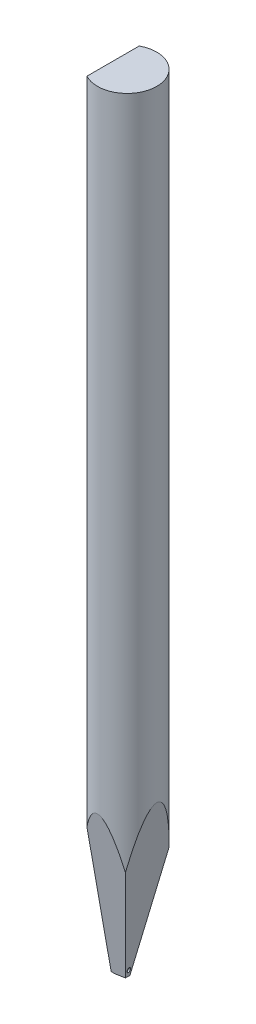
ISO-10303-21;
HEADER;
FILE_DESCRIPTION(('STEP AP214'),'2;1');
FILE_NAME('part.step','',(''),(''),'','','');
FILE_SCHEMA(('AUTOMOTIVE_DESIGN { 1 0 10303 214 1 1 1 1 }'));
ENDSEC;
DATA;
#1=APPLICATION_CONTEXT('core data for automotive mechanical design processes');
#2=APPLICATION_PROTOCOL_DEFINITION('international standard','automotive_design',2000,#1);
#3=PRODUCT_CONTEXT('',#1,'mechanical');
#4=PRODUCT('Part','Part','',(#3));
#5=PRODUCT_RELATED_PRODUCT_CATEGORY('part','',(#4));
#6=PRODUCT_DEFINITION_FORMATION('','',#4);
#7=PRODUCT_DEFINITION_CONTEXT('part definition',#1,'design');
#8=PRODUCT_DEFINITION('design','',#6,#7);
#9=PRODUCT_DEFINITION_SHAPE('','',#8);
#10=(LENGTH_UNIT() NAMED_UNIT(*) SI_UNIT(.MILLI.,.METRE.));
#11=(NAMED_UNIT(*) PLANE_ANGLE_UNIT() SI_UNIT($,.RADIAN.));
#12=(NAMED_UNIT(*) SI_UNIT($,.STERADIAN.) SOLID_ANGLE_UNIT());
#13=UNCERTAINTY_MEASURE_WITH_UNIT(LENGTH_MEASURE(1.E-05),#10,'distance_accuracy_value','');
#14=(GEOMETRIC_REPRESENTATION_CONTEXT(3) GLOBAL_UNCERTAINTY_ASSIGNED_CONTEXT((#13)) GLOBAL_UNIT_ASSIGNED_CONTEXT((#10,
#11,#12)) REPRESENTATION_CONTEXT('',''));
#15=CARTESIAN_POINT('',(0.,0.,0.));
#16=DIRECTION('',(0.,0.,1.));
#17=DIRECTION('',(1.,0.,0.));
#18=AXIS2_PLACEMENT_3D('',#15,#16,#17);
#19=CARTESIAN_POINT('',(26.8738719491216,0.,0.0508));
#20=DIRECTION('',(0.,-0.173648177666931,0.984807753012208));
#21=DIRECTION('',(0.,-0.984807753012208,-0.173648177666931));
#22=AXIS2_PLACEMENT_3D('',#19,#20,#21);
#23=PLANE('',#22);
#24=CARTESIAN_POINT('',(-0.35052,0.0254,0.0552787053099968));
#25=DIRECTION('',(0.,-0.173648177666931,0.984807753012208));
#26=DIRECTION('',(0.,-0.984807753012208,-0.173648177666931));
#27=AXIS2_PLACEMENT_3D('',#24,#25,#26);
#28=ELLIPSE('',#27,0.0257918359418979,0.0254);
#29=CARTESIAN_POINT('',(-0.35052,0.,0.0508000000000018));
#30=VERTEX_POINT('',#29);
#31=CARTESIAN_POINT('',(-0.37592,0.0254,0.0552787053099968));
#32=VERTEX_POINT('',#31);
#33=EDGE_CURVE('E68',#30,#32,#28,.F.);
#34=ORIENTED_EDGE('',*,*,#33,.F.);
#35=DIRECTION('',(-1.,0.,0.));
#36=VECTOR('',#35,1.);
#37=CARTESIAN_POINT('',(26.8738719491216,0.,0.0508));
#38=LINE('',#37,#36);
#39=CARTESIAN_POINT('',(-0.277370032000001,0.,0.0508));
#40=VERTEX_POINT('',#39);
#41=EDGE_CURVE('E421',#40,#30,#38,.T.);
#42=ORIENTED_EDGE('',*,*,#41,.F.);
#43=DIRECTION('',(-0.984346441568213,-0.173566836012845,-0.0306045161452665));
#44=VECTOR('',#43,1.);
#45=CARTESIAN_POINT('',(26.0304978179113,4.63878690685217,0.868743289435208));
#46=LINE('',#45,#44);
#47=CARTESIAN_POINT('',(0.0141435069447581,0.051401702157769,0.0598635069447552));
#48=VERTEX_POINT('',#47);
#49=EDGE_CURVE('E423',#48,#40,#46,.T.);
#50=ORIENTED_EDGE('',*,*,#49,.F.);
#51=DIRECTION('',(-0.171087869746036,-0.970287525247814,-0.171087869746036));
#52=VECTOR('',#51,1.);
#53=CARTESIAN_POINT('',(0.791557999082992,4.46033837772866,0.837277999082991));
#54=LINE('',#53,#52);
#55=CARTESIAN_POINT('',(0.537041505266774,3.0169036135559,0.582761505266773));
#56=VERTEX_POINT('',#55);
#57=EDGE_CURVE('E426',#56,#48,#54,.T.);
#58=ORIENTED_EDGE('',*,*,#57,.F.);
#59=CARTESIAN_POINT('',(0.,-0.288101116436578,0.));
#60=DIRECTION('',(0.,-0.173648177666931,0.984807753012208));
#61=DIRECTION('',(0.,-0.984807753012208,-0.173648177666931));
#62=AXIS2_PLACEMENT_3D('',#59,#60,#61);
#63=ELLIPSE('',#62,4.56371043248163,0.792479999999998);
#64=CARTESIAN_POINT('',(-0.37592,3.66844093071415,0.69764511322018));
#65=VERTEX_POINT('',#64);
#66=EDGE_CURVE('E415',#56,#65,#63,.T.);
#67=ORIENTED_EDGE('',*,*,#66,.T.);
#68=DIRECTION('',(0.,0.984807753012208,0.173648177666931));
#69=VECTOR('',#68,1.);
#70=CARTESIAN_POINT('',(-0.37592,20.251112252608,3.62161747949059));
#71=LINE('',#70,#69);
#72=EDGE_CURVE('E401',#32,#65,#71,.T.);
#73=ORIENTED_EDGE('',*,*,#72,.F.);
#74=EDGE_LOOP('',(#34,#42,#50,#58,#67,#73));
#75=FACE_BOUND('',#74,.T.);
#76=ADVANCED_FACE('F46',(#75),#23,.T.);
#77=CARTESIAN_POINT('',(26.8738719491216,0.,-0.0508));
#78=DIRECTION('',(0.,-0.173648177666931,-0.984807753012208));
#79=DIRECTION('',(0.,0.984807753012208,-0.173648177666931));
#80=AXIS2_PLACEMENT_3D('',#77,#78,#79);
#81=PLANE('',#80);
#82=CARTESIAN_POINT('',(-0.35052,0.0254,-0.0552787053099968));
#83=DIRECTION('',(0.,-0.173648177666931,-0.984807753012208));
#84=DIRECTION('',(0.,0.984807753012208,-0.173648177666931));
#85=AXIS2_PLACEMENT_3D('',#82,#83,#84);
#86=ELLIPSE('',#85,0.0257918359418979,0.0254);
#87=CARTESIAN_POINT('',(-0.37592,0.0254,-0.0552787053099968));
#88=VERTEX_POINT('',#87);
#89=CARTESIAN_POINT('',(-0.35052,0.,-0.0508000000000018));
#90=VERTEX_POINT('',#89);
#91=EDGE_CURVE('E478',#88,#90,#86,.F.);
#92=ORIENTED_EDGE('',*,*,#91,.F.);
#93=DIRECTION('',(0.,-0.984807753012208,0.173648177666931));
#94=VECTOR('',#93,1.);
#95=CARTESIAN_POINT('',(-0.37592,20.5255765703836,-3.67001294395617));
#96=LINE('',#95,#94);
#97=CARTESIAN_POINT('',(-0.37592,3.66844093071414,-0.69764511322018));
#98=VERTEX_POINT('',#97);
#99=EDGE_CURVE('E399',#98,#88,#96,.T.);
#100=ORIENTED_EDGE('',*,*,#99,.F.);
#101=CARTESIAN_POINT('',(0.,-0.288101116436578,0.));
#102=DIRECTION('',(0.,-0.173648177666931,-0.984807753012208));
#103=DIRECTION('',(0.,-0.984807753012208,0.173648177666931));
#104=AXIS2_PLACEMENT_3D('',#101,#102,#103);
#105=ELLIPSE('',#104,4.56371043248163,0.792479999999998);
#106=CARTESIAN_POINT('',(0.537041505266774,3.0169036135559,-0.582761505266773));
#107=VERTEX_POINT('',#106);
#108=EDGE_CURVE('E413',#98,#107,#105,.T.);
#109=ORIENTED_EDGE('',*,*,#108,.T.);
#110=DIRECTION('',(0.171087869746036,0.970287525247814,-0.171087869746036));
#111=VECTOR('',#110,1.);
#112=CARTESIAN_POINT('',(0.791557999082992,4.46033837772866,-0.837277999082991));
#113=LINE('',#112,#111);
#114=CARTESIAN_POINT('',(0.0141435069447581,0.051401702157769,-0.0598635069447552));
#115=VERTEX_POINT('',#114);
#116=EDGE_CURVE('E396',#115,#107,#113,.T.);
#117=ORIENTED_EDGE('',*,*,#116,.F.);
#118=DIRECTION('',(0.984346441568213,0.173566836012845,-0.0306045161452665));
#119=VECTOR('',#118,1.);
#120=CARTESIAN_POINT('',(26.0304978179113,4.63878690685217,-0.868743289435208));
#121=LINE('',#120,#119);
#122=CARTESIAN_POINT('',(-0.277370032000001,0.,-0.0508));
#123=VERTEX_POINT('',#122);
#124=EDGE_CURVE('E393',#123,#115,#121,.T.);
#125=ORIENTED_EDGE('',*,*,#124,.F.);
#126=DIRECTION('',(-1.,0.,0.));
#127=VECTOR('',#126,1.);
#128=CARTESIAN_POINT('',(26.8738719491216,0.,-0.0508));
#129=LINE('',#128,#127);
#130=EDGE_CURVE('E418',#123,#90,#129,.T.);
#131=ORIENTED_EDGE('',*,*,#130,.T.);
#132=EDGE_LOOP('',(#92,#100,#109,#117,#125,#131));
#133=FACE_BOUND('',#132,.T.);
#134=ADVANCED_FACE('F271',(#133),#81,.T.);
#135=CARTESIAN_POINT('',(-0.37592,0.,0.01397));
#136=DIRECTION('',(0.,0.422618261740697,0.906307787036651));
#137=DIRECTION('',(0.,-0.906307787036651,0.422618261740697));
#138=AXIS2_PLACEMENT_3D('',#135,#136,#137);
#139=PLANE('',#138);
#140=DIRECTION('',(1.,0.,0.));
#141=VECTOR('',#140,1.);
#142=CARTESIAN_POINT('',(-0.37592,0.,0.01397));
#143=LINE('',#142,#141);
#144=CARTESIAN_POINT('',(-0.35052,0.,0.0139699999999948));
#145=VERTEX_POINT('',#144);
#146=CARTESIAN_POINT('',(-0.320285479258089,0.,0.01397));
#147=VERTEX_POINT('',#146);
#148=EDGE_CURVE('E439',#145,#147,#143,.T.);
#149=ORIENTED_EDGE('',*,*,#148,.F.);
#150=CARTESIAN_POINT('',(-0.35052,0.0254,0.00212578548285797));
#151=DIRECTION('',(0.,0.422618261740697,0.906307787036651));
#152=DIRECTION('',(0.,0.906307787036651,-0.422618261740697));
#153=AXIS2_PLACEMENT_3D('',#150,#151,#152);
#154=ELLIPSE('',#153,0.0280257991416472,0.0254);
#155=CARTESIAN_POINT('',(-0.373759405370795,0.0151486567703607,0.00690606533721928));
#156=VERTEX_POINT('',#155);
#157=EDGE_CURVE('E193',#145,#156,#154,.F.);
#158=ORIENTED_EDGE('',*,*,#157,.T.);
#159=DIRECTION('',(1.,0.,0.));
#160=VECTOR('',#159,1.);
#161=CARTESIAN_POINT('',(-0.37592,0.0151486567703607,0.00690606533721928));
#162=LINE('',#161,#160);
#163=CARTESIAN_POINT('',(-0.315593019285911,0.0153362178491699,0.00681223538900085));
#164=VERTEX_POINT('',#163);
#165=EDGE_CURVE('E54',#156,#164,#162,.T.);
#166=ORIENTED_EDGE('',*,*,#165,.T.);
#167=CARTESIAN_POINT('',(-0.278493907204909,0.0299587616795187,0.));
#168=DIRECTION('',(0.,0.422618261740697,0.906307787036651));
#169=DIRECTION('',(-0.537278777543525,-0.764384261857971,0.356438235077525));
#170=AXIS2_PLACEMENT_3D('',#167,#168,#169);
#171=ELLIPSE('',#170,0.0693992577462933,0.0254);
#172=EDGE_CURVE('E373',#164,#147,#171,.T.);
#173=ORIENTED_EDGE('',*,*,#172,.T.);
#174=EDGE_LOOP('',(#149,#158,#166,#173));
#175=FACE_BOUND('',#174,.T.);
#176=ADVANCED_FACE('F268',(#175),#139,.F.);
#177=CARTESIAN_POINT('',(-0.37592,0.0151486567703607,-0.00690606533721928));
#178=DIRECTION('',(0.,0.422618261740697,-0.906307787036651));
#179=DIRECTION('',(0.,0.906307787036651,0.422618261740697));
#180=AXIS2_PLACEMENT_3D('',#177,#178,#179);
#181=PLANE('',#180);
#182=DIRECTION('',(1.,0.,0.));
#183=VECTOR('',#182,1.);
#184=CARTESIAN_POINT('',(-0.37592,0.0151486567703607,-0.00690606533721928));
#185=LINE('',#184,#183);
#186=CARTESIAN_POINT('',(-0.373759405370795,0.0151486567703607,-0.00690606533721928));
#187=VERTEX_POINT('',#186);
#188=CARTESIAN_POINT('',(-0.315269012538432,0.0151486567703607,-0.00690606533721928));
#189=VERTEX_POINT('',#188);
#190=EDGE_CURVE('E232',#187,#189,#185,.T.);
#191=ORIENTED_EDGE('',*,*,#190,.F.);
#192=CARTESIAN_POINT('',(-0.35052,0.0254,-0.00212578548286144));
#193=DIRECTION('',(0.,0.422618261740697,-0.906307787036651));
#194=DIRECTION('',(0.,-0.906307787036651,-0.422618261740697));
#195=AXIS2_PLACEMENT_3D('',#192,#193,#194);
#196=ELLIPSE('',#195,0.0280257991416472,0.0254);
#197=CARTESIAN_POINT('',(-0.35052,0.,-0.0139699999999983));
#198=VERTEX_POINT('',#197);
#199=EDGE_CURVE('E200',#187,#198,#196,.F.);
#200=ORIENTED_EDGE('',*,*,#199,.T.);
#201=DIRECTION('',(1.,0.,0.));
#202=VECTOR('',#201,1.);
#203=CARTESIAN_POINT('',(-0.37592,0.,-0.01397));
#204=LINE('',#203,#202);
#205=CARTESIAN_POINT('',(-0.320285479258089,0.,-0.01397));
#206=VERTEX_POINT('',#205);
#207=EDGE_CURVE('E234',#198,#206,#204,.T.);
#208=ORIENTED_EDGE('',*,*,#207,.T.);
#209=CARTESIAN_POINT('',(-0.278493907204909,0.0299587616795187,0.));
#210=DIRECTION('',(0.,0.422618261740697,-0.906307787036651));
#211=DIRECTION('',(-0.537278777543525,-0.764384261857971,-0.356438235077525));
#212=AXIS2_PLACEMENT_3D('',#209,#210,#211);
#213=ELLIPSE('',#212,0.0693992577462933,0.0254);
#214=EDGE_CURVE('E391',#206,#189,#213,.T.);
#215=ORIENTED_EDGE('',*,*,#214,.T.);
#216=EDGE_LOOP('',(#191,#200,#208,#215));
#217=FACE_BOUND('',#216,.T.);
#218=ADVANCED_FACE('F270',(#217),#181,.F.);
#219=CARTESIAN_POINT('',(-0.277370032,0.,27.2760283406468));
#220=DIRECTION('',(-0.173648177666931,0.984807753012208,0.));
#221=DIRECTION('',(-0.984807753012208,-0.173648177666931,0.));
#222=AXIS2_PLACEMENT_3D('',#219,#220,#221);
#223=PLANE('',#222);
#224=DIRECTION('',(-0.984807753012208,-0.173648177666931,0.));
#225=VECTOR('',#224,1.);
#226=CARTESIAN_POINT('',(-0.277370032,0.,0.0253999999999983));
#227=LINE('',#226,#225);
#228=CARTESIAN_POINT('',(-0.1397,0.0242749410765979,0.0253999999999992));
#229=VERTEX_POINT('',#228);
#230=CARTESIAN_POINT('',(-0.277370032,0.,0.0253999999999992));
#231=VERTEX_POINT('',#230);
#232=EDGE_CURVE('E369',#229,#231,#227,.T.);
#233=ORIENTED_EDGE('',*,*,#232,.F.);
#234=DIRECTION('',(0.,0.,1.));
#235=VECTOR('',#234,1.);
#236=CARTESIAN_POINT('',(-0.1397,0.0242749410765979,27.2760283406468));
#237=LINE('',#236,#235);
#238=CARTESIAN_POINT('',(-0.1397,0.0242749410765979,-0.0253999999999992));
#239=VERTEX_POINT('',#238);
#240=EDGE_CURVE('E387',#239,#229,#237,.T.);
#241=ORIENTED_EDGE('',*,*,#240,.F.);
#242=DIRECTION('',(-0.984807753012208,-0.173648177666931,0.));
#243=VECTOR('',#242,1.);
#244=CARTESIAN_POINT('',(-0.277370032,0.,-0.0253999999999983));
#245=LINE('',#244,#243);
#246=CARTESIAN_POINT('',(-0.277370032,0.,-0.0253999999999992));
#247=VERTEX_POINT('',#246);
#248=EDGE_CURVE('E389',#239,#247,#245,.T.);
#249=ORIENTED_EDGE('',*,*,#248,.T.);
#250=DIRECTION('',(0.,0.,-1.));
#251=VECTOR('',#250,1.);
#252=CARTESIAN_POINT('',(-0.277370032,0.,27.2760283406468));
#253=LINE('',#252,#251);
#254=EDGE_CURVE('E435',#247,#123,#253,.T.);
#255=ORIENTED_EDGE('',*,*,#254,.T.);
#256=ORIENTED_EDGE('',*,*,#124,.T.);
#257=DIRECTION('',(0.,0.,-1.));
#258=VECTOR('',#257,1.);
#259=CARTESIAN_POINT('',(0.014143506944755,0.0514017021577685,27.2760283406468));
#260=LINE('',#259,#258);
#261=EDGE_CURVE('E436',#48,#115,#260,.T.);
#262=ORIENTED_EDGE('',*,*,#261,.F.);
#263=ORIENTED_EDGE('',*,*,#49,.T.);
#264=EDGE_CURVE('E432',#40,#231,#253,.T.);
#265=ORIENTED_EDGE('',*,*,#264,.T.);
#266=EDGE_LOOP('',(#233,#241,#249,#255,#256,#262,#263,#265));
#267=FACE_BOUND('',#266,.T.);
#268=ADVANCED_FACE('F277',(#267),#223,.F.);
#269=CARTESIAN_POINT('',(0.,0.,0.));
#270=DIRECTION('',(0.,1.,0.));
#271=DIRECTION('',(0.,0.,1.));
#272=AXIS2_PLACEMENT_3D('',#269,#270,#271);
#273=PLANE('',#272);
#274=ORIENTED_EDGE('',*,*,#41,.T.);
#275=DIRECTION('',(0.,0.,-1.));
#276=VECTOR('',#275,1.);
#277=CARTESIAN_POINT('',(-0.35052,0.,26.4359805311631));
#278=LINE('',#277,#276);
#279=EDGE_CURVE('E202',#30,#145,#278,.T.);
#280=ORIENTED_EDGE('',*,*,#279,.T.);
#281=ORIENTED_EDGE('',*,*,#148,.T.);
#282=CARTESIAN_POINT('',(-0.295790606325167,0.,0.));
#283=DIRECTION('',(0.,1.,0.));
#284=DIRECTION('',(-1.,0.,0.));
#285=AXIS2_PLACEMENT_3D('',#282,#283,#284);
#286=ELLIPSE('',#285,0.0293293936748331,0.0254);
#287=CARTESIAN_POINT('',(-0.295790606325167,0.,0.0254));
#288=VERTEX_POINT('',#287);
#289=EDGE_CURVE('E375',#288,#147,#286,.F.);
#290=ORIENTED_EDGE('',*,*,#289,.F.);
#291=DIRECTION('',(1.,0.,0.));
#292=VECTOR('',#291,1.);
#293=CARTESIAN_POINT('',(-0.1397,0.,0.0254));
#294=LINE('',#293,#292);
#295=EDGE_CURVE('E464',#288,#231,#294,.T.);
#296=ORIENTED_EDGE('',*,*,#295,.T.);
#297=ORIENTED_EDGE('',*,*,#264,.F.);
#298=EDGE_LOOP('',(#274,#280,#281,#290,#296,#297));
#299=FACE_BOUND('',#298,.T.);
#300=ADVANCED_FACE('F301',(#299),#273,.F.);
#301=ORIENTED_EDGE('',*,*,#207,.F.);
#302=EDGE_CURVE('E204',#198,#90,#278,.T.);
#303=ORIENTED_EDGE('',*,*,#302,.T.);
#304=ORIENTED_EDGE('',*,*,#130,.F.);
#305=ORIENTED_EDGE('',*,*,#254,.F.);
#306=DIRECTION('',(1.,0.,0.));
#307=VECTOR('',#306,1.);
#308=CARTESIAN_POINT('',(-0.1397,0.,-0.0254));
#309=LINE('',#308,#307);
#310=CARTESIAN_POINT('',(-0.295790606325167,0.,-0.0254));
#311=VERTEX_POINT('',#310);
#312=EDGE_CURVE('E456',#311,#247,#309,.T.);
#313=ORIENTED_EDGE('',*,*,#312,.F.);
#314=EDGE_CURVE('E380',#206,#311,#286,.F.);
#315=ORIENTED_EDGE('',*,*,#314,.F.);
#316=EDGE_LOOP('',(#301,#303,#304,#305,#313,#315));
#317=FACE_BOUND('',#316,.T.);
#318=ADVANCED_FACE('F298',(#317),#273,.F.);
#319=CARTESIAN_POINT('',(0.,21.0312,0.));
#320=DIRECTION('',(0.,-1.,0.));
#321=DIRECTION('',(0.,0.,-1.));
#322=AXIS2_PLACEMENT_3D('',#319,#320,#321);
#323=CYLINDRICAL_SURFACE('',#322,0.792479999999998);
#324=ORIENTED_EDGE('',*,*,#66,.F.);
#325=CARTESIAN_POINT('',(0.,-0.0288101116436568,0.));
#326=DIRECTION('',(-0.984807753012208,0.173648177666931,0.));
#327=DIRECTION('',(-0.173648177666931,-0.984807753012208,0.));
#328=AXIS2_PLACEMENT_3D('',#325,#326,#327);
#329=ELLIPSE('',#328,4.56371043248164,0.792479999999998);
#330=EDGE_CURVE('E429',#56,#107,#329,.T.);
#331=ORIENTED_EDGE('',*,*,#330,.T.);
#332=ORIENTED_EDGE('',*,*,#108,.F.);
#333=DIRECTION('',(0.,-1.,0.));
#334=VECTOR('',#333,1.);
#335=CARTESIAN_POINT('',(-0.37592,21.0312,-0.69764511322018));
#336=LINE('',#335,#334);
#337=CARTESIAN_POINT('',(-0.37592,21.0312,-0.69764511322018));
#338=VERTEX_POINT('',#337);
#339=EDGE_CURVE('E406',#338,#98,#336,.T.);
#340=ORIENTED_EDGE('',*,*,#339,.F.);
#341=CARTESIAN_POINT('',(0.,21.0312,0.));
#342=DIRECTION('',(0.,1.,0.));
#343=DIRECTION('',(0.,0.,1.));
#344=AXIS2_PLACEMENT_3D('',#341,#342,#343);
#345=CIRCLE('',#344,0.792479999999998);
#346=CARTESIAN_POINT('',(-0.37592,21.0312,0.69764511322018));
#347=VERTEX_POINT('',#346);
#348=EDGE_CURVE('E403',#347,#338,#345,.T.);
#349=ORIENTED_EDGE('',*,*,#348,.F.);
#350=DIRECTION('',(0.,-1.,0.));
#351=VECTOR('',#350,1.);
#352=CARTESIAN_POINT('',(-0.37592,21.0312,0.69764511322018));
#353=LINE('',#352,#351);
#354=EDGE_CURVE('E409',#65,#347,#353,.F.);
#355=ORIENTED_EDGE('',*,*,#354,.F.);
#356=EDGE_LOOP('',(#324,#331,#332,#340,#349,#355));
#357=FACE_BOUND('',#356,.T.);
#358=ADVANCED_FACE('F293',(#357),#323,.T.);
#359=CARTESIAN_POINT('',(-0.37592,21.0312,-0.80247998));
#360=DIRECTION('',(-1.,0.,0.));
#361=DIRECTION('',(0.,0.,1.));
#362=AXIS2_PLACEMENT_3D('',#359,#360,#361);
#363=PLANE('',#362);
#364=DIRECTION('',(0.,0.,-1.));
#365=VECTOR('',#364,1.);
#366=CARTESIAN_POINT('',(-0.37592,0.0254,26.4359805311631));
#367=LINE('',#366,#365);
#368=EDGE_CURVE('E76',#32,#88,#367,.T.);
#369=ORIENTED_EDGE('',*,*,#368,.F.);
#370=ORIENTED_EDGE('',*,*,#72,.T.);
#371=ORIENTED_EDGE('',*,*,#354,.T.);
#372=DIRECTION('',(0.,0.,-1.));
#373=VECTOR('',#372,1.);
#374=CARTESIAN_POINT('',(-0.37592,21.0312,-0.80247998));
#375=LINE('',#374,#373);
#376=EDGE_CURVE('E411',#347,#338,#375,.T.);
#377=ORIENTED_EDGE('',*,*,#376,.T.);
#378=ORIENTED_EDGE('',*,*,#339,.T.);
#379=ORIENTED_EDGE('',*,*,#99,.T.);
#380=EDGE_LOOP('',(#369,#370,#371,#377,#378,#379));
#381=FACE_BOUND('',#380,.T.);
#382=ADVANCED_FACE('F289',(#381),#363,.T.);
#383=CARTESIAN_POINT('',(0.,21.0312,0.));
#384=DIRECTION('',(0.,1.,0.));
#385=DIRECTION('',(0.,0.,1.));
#386=AXIS2_PLACEMENT_3D('',#383,#384,#385);
#387=PLANE('',#386);
#388=ORIENTED_EDGE('',*,*,#348,.T.);
#389=ORIENTED_EDGE('',*,*,#376,.F.);
#390=EDGE_LOOP('',(#388,#389));
#391=FACE_BOUND('',#390,.T.);
#392=ADVANCED_FACE('F292',(#391),#387,.T.);
#393=CARTESIAN_POINT('',(0.014143506944755,0.0514017021577685,27.2760283406468));
#394=DIRECTION('',(-0.984807753012208,0.173648177666931,0.));
#395=DIRECTION('',(-0.173648177666931,-0.984807753012208,0.));
#396=AXIS2_PLACEMENT_3D('',#393,#394,#395);
#397=PLANE('',#396);
#398=CARTESIAN_POINT('',(0.0432817426572091,0.216652848609544,0.));
#399=DIRECTION('',(-0.984807753012208,0.173648177666931,0.));
#400=DIRECTION('',(0.173648177666931,0.984807753012208,0.));
#401=AXIS2_PLACEMENT_3D('',#398,#399,#400);
#402=ELLIPSE('',#401,0.0636490170805515,0.0457181771462286);
#403=CARTESIAN_POINT('',(0.0543342784835383,0.279334894102078,0.));
#404=VERTEX_POINT('',#403);
#405=EDGE_CURVE('E376',#404,#404,#402,.F.);
#406=ORIENTED_EDGE('',*,*,#405,.F.);
#407=EDGE_LOOP('',(#406));
#408=FACE_BOUND('',#407,.T.);
#409=ORIENTED_EDGE('',*,*,#330,.F.);
#410=ORIENTED_EDGE('',*,*,#57,.T.);
#411=ORIENTED_EDGE('',*,*,#261,.T.);
#412=ORIENTED_EDGE('',*,*,#116,.T.);
#413=EDGE_LOOP('',(#409,#410,#411,#412));
#414=FACE_BOUND('',#413,.T.);
#415=ADVANCED_FACE('F296',(#408,#414),#397,.F.);
#416=CARTESIAN_POINT('',(-0.37592,0.0119283056158966,0.));
#417=DIRECTION('',(1.,0.,0.));
#418=DIRECTION('',(0.,0.,-1.));
#419=AXIS2_PLACEMENT_3D('',#416,#417,#418);
#420=CYLINDRICAL_SURFACE('',#419,0.00762);
#421=ORIENTED_EDGE('',*,*,#165,.F.);
#422=CARTESIAN_POINT('',(-0.373759405370795,0.0151486567703607,0.00690606533721929));
#423=CARTESIAN_POINT('',(-0.373918569492674,0.0155088342614003,0.00673874202735514));
#424=CARTESIAN_POINT('',(-0.374063542242795,0.0158608135909136,0.00653973044425844));
#425=CARTESIAN_POINT('',(-0.374325699790525,0.0165356731370719,0.00608279414903892));
#426=CARTESIAN_POINT('',(-0.374442882537902,0.0168585512056585,0.00582486509298502));
#427=CARTESIAN_POINT('',(-0.374650230755841,0.017463029250826,0.00525403490174824));
#428=CARTESIAN_POINT('',(-0.374740343834588,0.0177445486490633,0.00494102900069116));
#429=CARTESIAN_POINT('',(-0.374895566105807,0.0182541830099982,0.00426910193453611));
#430=CARTESIAN_POINT('',(-0.374960692419946,0.0184823344999647,0.00391021243585705));
#431=CARTESIAN_POINT('',(-0.375067479314469,0.0188715116439433,0.00316667755482717));
#432=CARTESIAN_POINT('',(-0.375109706888839,0.0190341308445042,0.00278294644950003));
#433=CARTESIAN_POINT('',(-0.375175759671063,0.0192949420300951,0.00199255917909621));
#434=CARTESIAN_POINT('',(-0.37519957970398,0.0193931158963482,0.00158589660171274));
#435=CARTESIAN_POINT('',(-0.375230459957757,0.019521431064192,0.000762757478382951));
#436=CARTESIAN_POINT('',(-0.375237575672063,0.0195517976121361,0.000346318082727759));
#437=CARTESIAN_POINT('',(-0.375235770653128,0.0195441743859012,-0.000485901162882895));
#438=CARTESIAN_POINT('',(-0.375226849930595,0.0195061846573634,-0.000901681013278545));
#439=CARTESIAN_POINT('',(-0.375192240186376,0.0193629530830421,-0.00172160879679727));
#440=CARTESIAN_POINT('',(-0.375166518829734,0.0192575815606606,-0.00212573272733675));
#441=CARTESIAN_POINT('',(-0.375096470064278,0.0189830647765991,-0.00290985404253991));
#442=CARTESIAN_POINT('',(-0.375052148851522,0.0188139407543167,-0.00328985941318894));
#443=CARTESIAN_POINT('',(-0.374942467533666,0.0184182462547739,-0.00401435673573043));
#444=CARTESIAN_POINT('',(-0.374877148954908,0.0181917893505824,-0.00435891702630947));
#445=CARTESIAN_POINT('',(-0.374722805869762,0.0176894039603435,-0.00500415010146648));
#446=CARTESIAN_POINT('',(-0.374633768063604,0.0174134477476467,-0.00530479811680576));
#447=CARTESIAN_POINT('',(-0.374429448453116,0.0168212066958953,-0.00585557008225971));
#448=CARTESIAN_POINT('',(-0.374314053349978,0.0165047504248137,-0.00610546684764871));
#449=CARTESIAN_POINT('',(-0.37405674359812,0.0158443504712485,-0.00654898770445102));
#450=CARTESIAN_POINT('',(-0.373914829672878,0.0155004075387937,-0.00674261333066768));
#451=CARTESIAN_POINT('',(-0.373759405377014,0.015148656772915,-0.00690606534227172));
#452=B_SPLINE_CURVE_WITH_KNOTS('',3,(#422,#423,#424,#425,#426,#427,#428,#429,#430,#431,#432,
#433,#434,#435,#436,#437,#438,#439,#440,#441,#442,#443,#444,#445,#446,#447,#448,#449,#450,#451),
.UNSPECIFIED.,.F.,.F.,(4,2,2,2,2,2,2,2,2,2,2,2,2,2,4),(0.,0.00128249560791852,
0.00256508580359613,0.00385014261908029,0.00513431729640891,0.00638504520501917,
0.00763612460478515,0.00888304187338288,0.0101299583094204,0.0113792816940457,
0.0126281892289667,0.013874641849081,0.0151217948526254,0.0163744132384438,0.01762699745571),.UNSPECIFIED.);
#453=CARTESIAN_POINT('',(-0.374350280503026,0.016663301568816,0.00596014646120416));
#454=VERTEX_POINT('',#453);
#455=EDGE_CURVE('E188',#156,#454,#452,.T.);
#456=ORIENTED_EDGE('',*,*,#455,.T.);
#457=CARTESIAN_POINT('',(-0.37592,0.0151486567703607,-0.00690606533721928));
#458=CARTESIAN_POINT('',(-0.374657557355369,0.0164089620928749,-0.00631837531371742));
#459=CARTESIAN_POINT('',(-0.373329016037677,0.0176006675010706,-0.0052782069155326));
#460=CARTESIAN_POINT('',(-0.371525983962323,0.0191092293649109,-0.00291023911567302));
#461=CARTESIAN_POINT('',(-0.37084,0.0195483056158966,-0.00140383674248513));
#462=CARTESIAN_POINT('',(-0.37084,0.0195483056158966,0.00140383674248514));
#463=CARTESIAN_POINT('',(-0.371525983962323,0.0191092293649109,0.00291023911567302));
#464=CARTESIAN_POINT('',(-0.373329016037677,0.0176006675010706,0.0052782069155326));
#465=CARTESIAN_POINT('',(-0.374657557355369,0.0164089620928749,0.00631837531371743));
#466=CARTESIAN_POINT('',(-0.37592,0.0151486567703607,0.00690606533721929));
#467=(BOUNDED_CURVE() B_SPLINE_CURVE(3,(#457,#458,#459,#460,#461,#462,#463,#464,#465,#466),
.UNSPECIFIED.,.F.,.F.) B_SPLINE_CURVE_WITH_KNOTS((4,2,2,2,4),(3.57792496658837,4.14515697348653,
4.71238898038469,5.27962098728285,5.84685299418101),
.UNSPECIFIED.) CURVE() GEOMETRIC_REPRESENTATION_ITEM() RATIONAL_B_SPLINE_CURVE((1.,1.,1.,1.,1.,
1.,1.,1.,1.,1.)) REPRESENTATION_ITEM(''));
#468=CARTESIAN_POINT('',(-0.374350275961687,0.0166632978829762,-0.00596014941397921));
#469=VERTEX_POINT('',#468);
#470=EDGE_CURVE('E60',#454,#469,#467,.F.);
#471=ORIENTED_EDGE('',*,*,#470,.T.);
#472=EDGE_CURVE('E194',#469,#187,#452,.T.);
#473=ORIENTED_EDGE('',*,*,#472,.T.);
#474=ORIENTED_EDGE('',*,*,#190,.T.);
#475=CARTESIAN_POINT('',(-0.315269012536303,0.0151486567753676,0.00690606533488454));
#476=CARTESIAN_POINT('',(-0.317075862144197,0.0161842697077068,0.00642315109273634));
#477=CARTESIAN_POINT('',(-0.318024390122247,0.0168426865801395,0.00586533751326106));
#478=CARTESIAN_POINT('',(-0.321205224900538,0.0178280650693008,0.00487300346789817));
#479=CARTESIAN_POINT('',(-0.322493084762046,0.01822432148107,0.0043425292142816));
#480=CARTESIAN_POINT('',(-0.32609148347587,0.0192011622783262,0.00262713893289165));
#481=CARTESIAN_POINT('',(-0.328498574966247,0.0195485115973969,0.00128643598062931));
#482=CARTESIAN_POINT('',(-0.328498379543019,0.0195480994392216,-0.00128887502216802));
#483=CARTESIAN_POINT('',(-0.326090185720157,0.0191998834727003,-0.00263031717495489));
#484=CARTESIAN_POINT('',(-0.322493497696284,0.0182229737514301,-0.00434442819088656));
#485=CARTESIAN_POINT('',(-0.321206399154967,0.017826217008688,-0.0048751189381856));
#486=CARTESIAN_POINT('',(-0.318024146320896,0.0168417745971261,-0.00586600085485588));
#487=CARTESIAN_POINT('',(-0.317076638255054,0.0161839301006344,-0.00642330945502904));
#488=CARTESIAN_POINT('',(-0.315269012538432,0.0151486567703607,-0.00690606533721928));
#489=(BOUNDED_CURVE() B_SPLINE_CURVE(3,(#475,#476,#477,#478,#479,#480,#481,#482,#483,#484,#485,
#486,#487,#488),.UNSPECIFIED.,.F.,.F.) B_SPLINE_CURVE_WITH_KNOTS((4,2,2,2,2,2,4),(0.,
2.19282797730596E-06,4.38565595461191E-06,8.7713119092238E-06,1.31569678638357E-05,
1.53497958411416E-05,1.75426238184476E-05),
.UNSPECIFIED.) CURVE() GEOMETRIC_REPRESENTATION_ITEM() RATIONAL_B_SPLINE_CURVE((1.,1.,1.,1.,1.,
1.,1.,1.,1.,1.,1.,1.,1.,1.)) REPRESENTATION_ITEM(''));
#490=EDGE_CURVE('E367',#189,#164,#489,.F.);
#491=ORIENTED_EDGE('',*,*,#490,.T.);
#492=EDGE_LOOP('',(#421,#456,#471,#473,#474,#491));
#493=FACE_BOUND('',#492,.T.);
#494=ADVANCED_FACE('F189',(#493),#420,.F.);
#495=CARTESIAN_POINT('',(-0.1397,0.09144,0.0254));
#496=DIRECTION('',(-1.,0.,0.));
#497=DIRECTION('',(0.,-1.,0.));
#498=AXIS2_PLACEMENT_3D('',#495,#496,#497);
#499=PLANE('',#498);
#500=ORIENTED_EDGE('',*,*,#240,.T.);
#501=DIRECTION('',(0.,1.,0.));
#502=VECTOR('',#501,1.);
#503=CARTESIAN_POINT('',(-0.1397,0.09144,0.0254));
#504=LINE('',#503,#502);
#505=CARTESIAN_POINT('',(-0.1397,0.09144,0.0254));
#506=VERTEX_POINT('',#505);
#507=EDGE_CURVE('E462',#229,#506,#504,.T.);
#508=ORIENTED_EDGE('',*,*,#507,.T.);
#509=DIRECTION('',(0.,0.,-1.));
#510=VECTOR('',#509,1.);
#511=CARTESIAN_POINT('',(-0.1397,0.09144,0.0254));
#512=LINE('',#511,#510);
#513=CARTESIAN_POINT('',(-0.1397,0.09144,0.01905));
#514=VERTEX_POINT('',#513);
#515=EDGE_CURVE('E449',#506,#514,#512,.T.);
#516=ORIENTED_EDGE('',*,*,#515,.T.);
#517=CARTESIAN_POINT('',(-0.1397,0.0914400000000001,0.));
#518=DIRECTION('',(1.,0.,0.));
#519=DIRECTION('',(0.,1.,0.));
#520=AXIS2_PLACEMENT_3D('',#517,#518,#519);
#521=ELLIPSE('',#520,0.0219970452561247,0.01905);
#522=CARTESIAN_POINT('',(-0.1397,0.09144,-0.0190499999999996));
#523=VERTEX_POINT('',#522);
#524=EDGE_CURVE('E461',#523,#514,#521,.F.);
#525=ORIENTED_EDGE('',*,*,#524,.F.);
#526=CARTESIAN_POINT('',(-0.1397,0.09144,-0.0254));
#527=VERTEX_POINT('',#526);
#528=EDGE_CURVE('E452',#523,#527,#512,.T.);
#529=ORIENTED_EDGE('',*,*,#528,.T.);
#530=DIRECTION('',(0.,1.,0.));
#531=VECTOR('',#530,1.);
#532=CARTESIAN_POINT('',(-0.1397,0.09144,-0.0254));
#533=LINE('',#532,#531);
#534=EDGE_CURVE('E453',#239,#527,#533,.T.);
#535=ORIENTED_EDGE('',*,*,#534,.F.);
#536=EDGE_LOOP('',(#500,#508,#516,#525,#529,#535));
#537=FACE_BOUND('',#536,.T.);
#538=ADVANCED_FACE('F514',(#537),#499,.T.);
#539=CARTESIAN_POINT('',(0.,0.,0.0254));
#540=DIRECTION('',(0.,0.,-1.));
#541=DIRECTION('',(-1.,0.,0.));
#542=AXIS2_PLACEMENT_3D('',#539,#540,#541);
#543=PLANE('',#542);
#544=ORIENTED_EDGE('',*,*,#232,.T.);
#545=ORIENTED_EDGE('',*,*,#295,.F.);
#546=DIRECTION('',(-0.500000000000004,-0.866025403784436,0.));
#547=VECTOR('',#546,1.);
#548=CARTESIAN_POINT('',(-0.221842954743874,0.128081089639199,0.0254));
#549=LINE('',#548,#547);
#550=CARTESIAN_POINT('',(-0.242997697710467,0.09144,0.0254));
#551=VERTEX_POINT('',#550);
#552=EDGE_CURVE('E447',#551,#288,#549,.T.);
#553=ORIENTED_EDGE('',*,*,#552,.F.);
#554=DIRECTION('',(-1.,0.,0.));
#555=VECTOR('',#554,1.);
#556=CARTESIAN_POINT('',(-0.2723270913853,0.09144,0.0254));
#557=LINE('',#556,#555);
#558=EDGE_CURVE('E455',#506,#551,#557,.T.);
#559=ORIENTED_EDGE('',*,*,#558,.F.);
#560=ORIENTED_EDGE('',*,*,#507,.F.);
#561=EDGE_LOOP('',(#544,#545,#553,#559,#560));
#562=FACE_BOUND('',#561,.T.);
#563=ADVANCED_FACE('F523',(#562),#543,.T.);
#564=CARTESIAN_POINT('',(0.,0.,-0.0254));
#565=DIRECTION('',(0.,0.,-1.));
#566=DIRECTION('',(-1.,0.,0.));
#567=AXIS2_PLACEMENT_3D('',#564,#565,#566);
#568=PLANE('',#567);
#569=ORIENTED_EDGE('',*,*,#534,.T.);
#570=DIRECTION('',(-1.,0.,0.));
#571=VECTOR('',#570,1.);
#572=CARTESIAN_POINT('',(-0.2723270913853,0.09144,-0.0254));
#573=LINE('',#572,#571);
#574=CARTESIAN_POINT('',(-0.242997697710467,0.09144,-0.0254));
#575=VERTEX_POINT('',#574);
#576=EDGE_CURVE('E458',#527,#575,#573,.T.);
#577=ORIENTED_EDGE('',*,*,#576,.T.);
#578=DIRECTION('',(0.500000000000004,0.866025403784436,0.));
#579=VECTOR('',#578,1.);
#580=CARTESIAN_POINT('',(-0.242997697710467,0.09144,-0.0254));
#581=LINE('',#580,#579);
#582=EDGE_CURVE('E444',#311,#575,#581,.T.);
#583=ORIENTED_EDGE('',*,*,#582,.F.);
#584=ORIENTED_EDGE('',*,*,#312,.T.);
#585=ORIENTED_EDGE('',*,*,#248,.F.);
#586=EDGE_LOOP('',(#569,#577,#583,#584,#585));
#587=FACE_BOUND('',#586,.T.);
#588=ADVANCED_FACE('F508',(#587),#568,.F.);
#589=CARTESIAN_POINT('',(-0.0103574919504674,0.166115931840058,0.));
#590=DIRECTION('',(0.866025403784441,0.499999999999995,0.));
#591=DIRECTION('',(-0.499999999999995,0.866025403784441,0.));
#592=AXIS2_PLACEMENT_3D('',#589,#590,#591);
#593=CONICAL_SURFACE('',#592,0.01905,0.392699081698725);
#594=CARTESIAN_POINT('',(-0.0103574919504674,0.166115931840058,0.));
#595=DIRECTION('',(0.866025403784441,0.499999999999995,0.));
#596=DIRECTION('',(-0.499999999999995,0.866025403784441,0.));
#597=AXIS2_PLACEMENT_3D('',#594,#595,#596);
#598=CIRCLE('',#597,0.01905);
#599=CARTESIAN_POINT('',(-0.0198824919504673,0.182613715782152,0.));
#600=VERTEX_POINT('',#599);
#601=EDGE_CURVE('E474',#600,#600,#598,.T.);
#602=ORIENTED_EDGE('',*,*,#601,.F.);
#603=EDGE_LOOP('',(#602));
#604=FACE_BOUND('',#603,.T.);
#605=ORIENTED_EDGE('',*,*,#405,.T.);
#606=EDGE_LOOP('',(#605));
#607=FACE_BOUND('',#606,.T.);
#608=ADVANCED_FACE('F223',(#604,#607),#593,.F.);
#609=CARTESIAN_POINT('',(-0.242997697710467,0.09144,0.));
#610=DIRECTION('',(-0.500000000000004,-0.866025403784436,0.));
#611=DIRECTION('',(0.866025403784436,-0.500000000000004,0.));
#612=AXIS2_PLACEMENT_3D('',#609,#610,#611);
#613=CYLINDRICAL_SURFACE('',#612,0.0254);
#614=ORIENTED_EDGE('',*,*,#172,.F.);
#615=CARTESIAN_POINT('',(-0.315269012538432,0.0151486567703607,-0.00690606533721928));
#616=CARTESIAN_POINT('',(-0.314064740053476,0.016646961575744,-0.00794585505886202));
#617=CARTESIAN_POINT('',(-0.31321167882475,0.017328321021174,-0.00900672485188979));
#618=CARTESIAN_POINT('',(-0.310850328777532,0.0218147902637276,-0.00846549667812212));
#619=CARTESIAN_POINT('',(-0.309954904233042,0.0236634317746743,-0.00806005375484559));
#620=CARTESIAN_POINT('',(-0.30774476226958,0.0287635065123828,-0.00595926807008118));
#621=CARTESIAN_POINT('',(-0.306501549507981,0.0322475478112238,-0.00266600063170046));
#622=CARTESIAN_POINT('',(-0.30650131472708,0.0322490627122478,0.00266071604169993));
#623=CARTESIAN_POINT('',(-0.307743449421622,0.0287699370132522,0.00595145727597174));
#624=CARTESIAN_POINT('',(-0.309954570595997,0.0236660496677867,0.00805715520836235));
#625=CARTESIAN_POINT('',(-0.310850112412452,0.0218176274080175,0.00846205532848539));
#626=CARTESIAN_POINT('',(-0.313210438313038,0.0173313181680342,0.00900564600086471));
#627=CARTESIAN_POINT('',(-0.314065447147888,0.0166466191381255,0.0079442936910818));
#628=CARTESIAN_POINT('',(-0.315269012536303,0.0151486567753676,0.00690606533488454));
#629=(BOUNDED_CURVE() B_SPLINE_CURVE(3,(#615,#616,#617,#618,#619,#620,#621,#622,#623,#624,#625,
#626,#627,#628),.UNSPECIFIED.,.F.,.F.) B_SPLINE_CURVE_WITH_KNOTS((4,2,2,2,2,2,4),(0.,
2.19282797730596E-06,4.38565595461191E-06,8.7713119092238E-06,1.31569678638357E-05,
1.53497958411416E-05,1.75426238184476E-05),
.UNSPECIFIED.) CURVE() GEOMETRIC_REPRESENTATION_ITEM() RATIONAL_B_SPLINE_CURVE((1.,1.,1.,1.,1.,
1.,1.,1.,1.,1.,1.,1.,1.,1.)) REPRESENTATION_ITEM(''));
#630=EDGE_CURVE('E184',#164,#189,#629,.F.);
#631=ORIENTED_EDGE('',*,*,#630,.T.);
#632=ORIENTED_EDGE('',*,*,#214,.F.);
#633=ORIENTED_EDGE('',*,*,#314,.T.);
#634=ORIENTED_EDGE('',*,*,#582,.T.);
#635=CARTESIAN_POINT('',(-0.242997697710467,0.09144,0.));
#636=DIRECTION('',(0.,-1.,0.));
#637=DIRECTION('',(-1.,0.,0.));
#638=AXIS2_PLACEMENT_3D('',#635,#636,#637);
#639=ELLIPSE('',#638,0.0293293936748331,0.0254);
#640=EDGE_CURVE('E442',#575,#551,#639,.F.);
#641=ORIENTED_EDGE('',*,*,#640,.T.);
#642=ORIENTED_EDGE('',*,*,#552,.T.);
#643=ORIENTED_EDGE('',*,*,#289,.T.);
#644=EDGE_LOOP('',(#614,#631,#632,#633,#634,#641,#642,#643));
#645=FACE_BOUND('',#644,.T.);
#646=ADVANCED_FACE('F254',(#645),#613,.F.);
#647=CARTESIAN_POINT('',(-0.2723270913853,0.09144,0.0254));
#648=DIRECTION('',(0.,-1.,0.));
#649=DIRECTION('',(0.,0.,-1.));
#650=AXIS2_PLACEMENT_3D('',#647,#648,#649);
#651=PLANE('',#650);
#652=ORIENTED_EDGE('',*,*,#576,.F.);
#653=ORIENTED_EDGE('',*,*,#528,.F.);
#654=CARTESIAN_POINT('',(-0.1397,0.09144,0.));
#655=DIRECTION('',(0.,1.,0.));
#656=DIRECTION('',(1.,0.,0.));
#657=AXIS2_PLACEMENT_3D('',#654,#655,#656);
#658=ELLIPSE('',#657,0.0381000000000004,0.01905);
#659=EDGE_CURVE('E471',#514,#523,#658,.F.);
#660=ORIENTED_EDGE('',*,*,#659,.F.);
#661=ORIENTED_EDGE('',*,*,#515,.F.);
#662=ORIENTED_EDGE('',*,*,#558,.T.);
#663=ORIENTED_EDGE('',*,*,#640,.F.);
#664=EDGE_LOOP('',(#652,#653,#660,#661,#662,#663));
#665=FACE_BOUND('',#664,.T.);
#666=ADVANCED_FACE('F266',(#665),#651,.T.);
#667=CARTESIAN_POINT('',(-0.36807289524413,-0.0404111525448111,0.));
#668=DIRECTION('',(0.866025403784441,0.499999999999995,0.));
#669=DIRECTION('',(-0.499999999999995,0.866025403784441,0.));
#670=AXIS2_PLACEMENT_3D('',#667,#668,#669);
#671=CYLINDRICAL_SURFACE('',#670,0.01905);
#672=ORIENTED_EDGE('',*,*,#524,.T.);
#673=ORIENTED_EDGE('',*,*,#659,.T.);
#674=EDGE_LOOP('',(#672,#673));
#675=FACE_BOUND('',#674,.T.);
#676=ORIENTED_EDGE('',*,*,#601,.T.);
#677=EDGE_LOOP('',(#676));
#678=FACE_BOUND('',#677,.T.);
#679=ADVANCED_FACE('F311',(#675,#678),#671,.F.);
#680=CARTESIAN_POINT('',(-0.315269012538432,0.0151486567703607,-0.00690606533721928));
#681=CARTESIAN_POINT('',(-0.317076638255054,0.0161839301006344,-0.00642330945502904));
#682=CARTESIAN_POINT('',(-0.318024146320896,0.0168417745971261,-0.00586600085485588));
#683=CARTESIAN_POINT('',(-0.321206399154967,0.017826217008688,-0.0048751189381856));
#684=CARTESIAN_POINT('',(-0.322493497696284,0.0182229737514301,-0.00434442819088656));
#685=CARTESIAN_POINT('',(-0.326090185720157,0.0191998834727003,-0.00263031717495489));
#686=CARTESIAN_POINT('',(-0.328498379543019,0.0195480994392216,-0.00128887502216802));
#687=CARTESIAN_POINT('',(-0.328498574966247,0.0195485115973969,0.00128643598062931));
#688=CARTESIAN_POINT('',(-0.32609148347587,0.0192011622783262,0.00262713893289165));
#689=CARTESIAN_POINT('',(-0.322493084762046,0.01822432148107,0.0043425292142816));
#690=CARTESIAN_POINT('',(-0.321205224900538,0.0178280650693008,0.00487300346789817));
#691=CARTESIAN_POINT('',(-0.318024390122247,0.0168426865801395,0.00586533751326106));
#692=CARTESIAN_POINT('',(-0.317075862144197,0.0161842697077068,0.00642315109273634));
#693=CARTESIAN_POINT('',(-0.315269012536303,0.0151486567753676,0.00690606533488454));
#694=CARTESIAN_POINT('',(-0.315269012538432,0.0151486567703607,-0.00690606533721928));
#695=CARTESIAN_POINT('',(-0.315120486522134,0.0158199965253581,-0.00661431557414351));
#696=CARTESIAN_POINT('',(-0.314947832081925,0.0162821372954698,-0.0065127876698675));
#697=CARTESIAN_POINT('',(-0.314654208558188,0.0176633957384299,-0.00495518635422847));
#698=CARTESIAN_POINT('',(-0.314534880309994,0.0182379105643819,-0.00428608178505053));
#699=CARTESIAN_POINT('',(-0.314157359409373,0.0194206931443965,-0.00230753882612486));
#700=CARTESIAN_POINT('',(-0.313833936474096,0.0195481253526305,-0.00108049930522362));
#701=CARTESIAN_POINT('',(-0.313833624664895,0.0195484858159152,0.00107888412491728));
#702=CARTESIAN_POINT('',(-0.314156416186084,0.0194223293796546,0.00230328032161248));
#703=CARTESIAN_POINT('',(-0.314534169535949,0.0182392583122159,0.00428423037744248));
#704=CARTESIAN_POINT('',(-0.314653411486889,0.0176654958351417,0.00495301010631532));
#705=CARTESIAN_POINT('',(-0.314947188135371,0.0162835841552511,0.00651176693900163));
#706=CARTESIAN_POINT('',(-0.315120545071262,0.0158192977139651,0.00661437911874128));
#707=CARTESIAN_POINT('',(-0.315269012536303,0.0151486567753676,0.00690606533488454));
#708=CARTESIAN_POINT('',(-0.315269012538432,0.0151486567703607,-0.00690606533721928));
#709=CARTESIAN_POINT('',(-0.314064740053476,0.016646961575744,-0.00794585505886202));
#710=CARTESIAN_POINT('',(-0.31321167882475,0.017328321021174,-0.00900672485188979));
#711=CARTESIAN_POINT('',(-0.310850328777532,0.0218147902637276,-0.00846549667812212));
#712=CARTESIAN_POINT('',(-0.309954904233042,0.0236634317746743,-0.00806005375484559));
#713=CARTESIAN_POINT('',(-0.30774476226958,0.0287635065123828,-0.00595926807008118));
#714=CARTESIAN_POINT('',(-0.306501549507981,0.0322475478112238,-0.00266600063170046));
#715=CARTESIAN_POINT('',(-0.30650131472708,0.0322490627122478,0.00266071604169993));
#716=CARTESIAN_POINT('',(-0.307743449421622,0.0287699370132522,0.00595145727597174));
#717=CARTESIAN_POINT('',(-0.309954570595997,0.0236660496677867,0.00805715520836235));
#718=CARTESIAN_POINT('',(-0.310850112412452,0.0218176274080175,0.00846205532848539));
#719=CARTESIAN_POINT('',(-0.313210438313038,0.0173313181680342,0.00900564600086471));
#720=CARTESIAN_POINT('',(-0.314065447147888,0.0166466191381255,0.0079442936910818));
#721=CARTESIAN_POINT('',(-0.315269012536303,0.0151486567753676,0.00690606533488454));
#722=(BOUNDED_SURFACE() B_SPLINE_SURFACE(2,3,((#680,#681,#682,#683,#684,#685,#686,#687,#688,
#689,#690,#691,#692,#693),(#694,#695,#696,#697,#698,#699,#700,#701,#702,#703,#704,#705,#706,
#707),(#708,#709,#710,#711,#712,#713,#714,#715,#716,#717,#718,#719,#720,#721)),.UNSPECIFIED.,
.F.,.F.,.F.) B_SPLINE_SURFACE_WITH_KNOTS((3,3),(4,2,2,2,2,2,4),(0.,1.),(0.,2.19282797730596E-06,
4.38565595461191E-06,8.7713119092238E-06,1.31569678638357E-05,1.53497958411416E-05,
1.75426238184476E-05),
.UNSPECIFIED.) GEOMETRIC_REPRESENTATION_ITEM() RATIONAL_B_SPLINE_SURFACE(((1.,1.,1.,1.,1.,1.,1.,
1.,1.,1.,1.,1.,1.,1.),(0.851400835815081,0.877068252240868,0.889296589291217,0.885793906314998,
0.884713499104295,0.879456324270975,0.866029756346795,0.866021055575286,0.879411413067204,
0.884706175772861,0.885785824690995,0.88928843502504,0.877076959005823,0.851400835860604),(1.,
1.,1.,1.,1.,1.,1.,1.,1.,1.,1.,1.,1.,1.))) REPRESENTATION_ITEM('') SURFACE());
#723=ORIENTED_EDGE('',*,*,#490,.F.);
#724=ORIENTED_EDGE('',*,*,#630,.F.);
#725=EDGE_LOOP('',(#723,#724));
#726=FACE_BOUND('',#725,.T.);
#727=ADVANCED_FACE('F305',(#726),#722,.T.);
#728=CARTESIAN_POINT('',(-0.37592,0.0151486567703607,-0.00690606533721928));
#729=CARTESIAN_POINT('',(-0.37592,0.01687533760177,-0.00740601168501109));
#730=CARTESIAN_POINT('',(-0.37592,0.0195437584215319,-0.00717876204243692));
#731=CARTESIAN_POINT('',(-0.37592,0.0230572276934532,-0.0047627217530712));
#732=CARTESIAN_POINT('',(-0.37592,0.0246283056158959,-0.00219021533970976));
#733=CARTESIAN_POINT('',(-0.37592,0.0246283056158959,0.00219021533970976));
#734=CARTESIAN_POINT('',(-0.37592,0.0230572276934532,0.0047627217530712));
#735=CARTESIAN_POINT('',(-0.37592,0.0195437584215319,0.00717876204243692));
#736=CARTESIAN_POINT('',(-0.37592,0.01687533760177,0.0074060116850111));
#737=CARTESIAN_POINT('',(-0.37592,0.0151486567703607,0.00690606533721929));
#738=CARTESIAN_POINT('',(-0.37592,0.0151486567703607,-0.00690606533721928));
#739=CARTESIAN_POINT('',(-0.37592,0.0164252564500502,-0.00628860281416217));
#740=CARTESIAN_POINT('',(-0.37592,0.017600667501071,-0.00527820691553238));
#741=CARTESIAN_POINT('',(-0.37592,0.0191092293649109,-0.00291023911567301));
#742=CARTESIAN_POINT('',(-0.375919999999999,0.0195483056158966,-0.00140383674248517));
#743=CARTESIAN_POINT('',(-0.375919999999999,0.0195483056158966,0.00140383674248516));
#744=CARTESIAN_POINT('',(-0.37592,0.0191092293649109,0.00291023911567301));
#745=CARTESIAN_POINT('',(-0.37592,0.017600667501071,0.00527820691553238));
#746=CARTESIAN_POINT('',(-0.37592,0.0164252564500502,0.00628860281416217));
#747=CARTESIAN_POINT('',(-0.37592,0.0151486567703607,0.00690606533721929));
#748=CARTESIAN_POINT('',(-0.37592,0.0151486567703607,-0.00690606533721928));
#749=CARTESIAN_POINT('',(-0.374657557355369,0.0164089620928749,-0.00631837531371742));
#750=CARTESIAN_POINT('',(-0.373329016037677,0.0176006675010706,-0.0052782069155326));
#751=CARTESIAN_POINT('',(-0.371525983962323,0.0191092293649109,-0.00291023911567302));
#752=CARTESIAN_POINT('',(-0.37084,0.0195483056158966,-0.00140383674248513));
#753=CARTESIAN_POINT('',(-0.37084,0.0195483056158966,0.00140383674248514));
#754=CARTESIAN_POINT('',(-0.371525983962323,0.0191092293649109,0.00291023911567302));
#755=CARTESIAN_POINT('',(-0.373329016037677,0.0176006675010706,0.0052782069155326));
#756=CARTESIAN_POINT('',(-0.374657557355369,0.0164089620928749,0.00631837531371743));
#757=CARTESIAN_POINT('',(-0.37592,0.0151486567703607,0.00690606533721929));
#758=(BOUNDED_SURFACE() B_SPLINE_SURFACE(2,3,((#728,#729,#730,#731,#732,#733,#734,#735,#736,
#737),(#738,#739,#740,#741,#742,#743,#744,#745,#746,#747),(#748,#749,#750,#751,#752,#753,#754,
#755,#756,#757)),.UNSPECIFIED.,.F.,.F.,.F.) B_SPLINE_SURFACE_WITH_KNOTS((3,3),(4,2,2,2,4),(0.,
1.),(3.57792496658837,4.14515697348653,4.71238898038469,5.27962098728285,5.84685299418101),
.UNSPECIFIED.) GEOMETRIC_REPRESENTATION_ITEM() RATIONAL_B_SPLINE_SURFACE(((1.,1.,1.,1.,1.,1.,1.,
1.,1.,1.),(0.707106781186548,0.707106781186548,0.707106781186533,0.707106781186533,
0.707106781186594,0.707106781186594,0.707106781186533,0.707106781186533,0.707106781186548,
0.707106781186548),(1.,1.,1.,1.,1.,1.,1.,1.,1.,1.))) REPRESENTATION_ITEM('') SURFACE());
#759=CARTESIAN_POINT('',(-0.374362869315172,0.0166434263082614,-0.00597263292098239));
#760=CARTESIAN_POINT('',(-0.374502457857009,0.0170194839813411,-0.00572875281201831));
#761=CARTESIAN_POINT('',(-0.374640000592807,0.0174252394321328,-0.00556331635939136));
#762=CARTESIAN_POINT('',(-0.374900715447758,0.0182644933655924,-0.00527990482107844));
#763=CARTESIAN_POINT('',(-0.375023735918156,0.018698221975287,-0.00516240363129829));
#764=CARTESIAN_POINT('',(-0.3753003212521,0.0197816485552665,-0.00478669829511691));
#765=CARTESIAN_POINT('',(-0.375435052225756,0.0204228354742746,-0.00448685525453978));
#766=CARTESIAN_POINT('',(-0.375618160002176,0.0214696801146733,-0.00383547727380386));
#767=CARTESIAN_POINT('',(-0.375679823568462,0.0218935595851551,-0.00351694264326652));
#768=CARTESIAN_POINT('',(-0.37576626663588,0.0225920402835827,-0.00287507846676783));
#769=CARTESIAN_POINT('',(-0.375796005975135,0.0228794507034355,-0.00256600254753214));
#770=CARTESIAN_POINT('',(-0.375847905505723,0.023461065128875,-0.00179702102938221));
#771=CARTESIAN_POINT('',(-0.37586572293765,0.0237353421756985,-0.00131901874970061));
#772=CARTESIAN_POINT('',(-0.375880089431267,0.0239727826273832,-0.000494819082795847));
#773=CARTESIAN_POINT('',(-0.375882391680373,0.0240177618274221,-0.000176059990370263));
#774=CARTESIAN_POINT('',(-0.375880583266054,0.0239858466242536,0.000455554899142357));
#775=CARTESIAN_POINT('',(-0.375876450528993,0.0239085327101642,0.00076838663448897));
#776=CARTESIAN_POINT('',(-0.375857777230091,0.0236145108756001,0.00153907598321268));
#777=CARTESIAN_POINT('',(-0.375838504906739,0.0233422156124892,0.00197238267852339));
#778=CARTESIAN_POINT('',(-0.375760986634132,0.0225166209692508,0.00300630496175581));
#779=CARTESIAN_POINT('',(-0.375686092352779,0.02189338426045,0.00354667093058209));
#780=CARTESIAN_POINT('',(-0.375454897053218,0.0205082779832787,0.00445231487875838));
#781=CARTESIAN_POINT('',(-0.375295155962816,0.0197415116049443,0.00480883340001482));
#782=CARTESIAN_POINT('',(-0.374985327727316,0.0185610871391352,0.00520408308135093));
#783=CARTESIAN_POINT('',(-0.374869339625917,0.0181597998491789,0.00531282427315118));
#784=CARTESIAN_POINT('',(-0.374623603767244,0.0173774149891009,0.00558017227610836));
#785=CARTESIAN_POINT('',(-0.374493760774395,0.0169964882891531,0.00573914119920079));
#786=CARTESIAN_POINT('',(-0.374362869366367,0.0166434263291885,0.00597263290400566));
#787=B_SPLINE_CURVE_WITH_KNOTS('',3,(#759,#760,#761,#762,#763,#764,#765,#766,#767,#768,#769,
#770,#771,#772,#773,#774,#775,#776,#777,#778,#779,#780,#781,#782,#783,#784,#785,#786),
.UNSPECIFIED.,.F.,.F.,(4,2,2,2,2,2,2,2,2,2,2,2,2,4),(0.,0.00138095185913467,0.00277524320343819,
0.00491497821865433,0.00650572556586752,0.00777173238727143,0.00938639099471668,
0.0103321050692506,0.0112810703368395,0.0127950499952012,0.0152370440460553,0.0177865893441703,
0.0190786308202216,0.0203802082634881),.UNSPECIFIED.);
#788=EDGE_CURVE('E12',#469,#454,#787,.T.);
#789=ORIENTED_EDGE('',*,*,#788,.F.);
#790=ORIENTED_EDGE('',*,*,#470,.F.);
#791=EDGE_LOOP('',(#789,#790));
#792=FACE_BOUND('',#791,.T.);
#793=ADVANCED_FACE('F49',(#792),#758,.T.);
#794=CARTESIAN_POINT('',(-0.35052,0.0254,26.4359805311631));
#795=DIRECTION('',(0.,0.,-1.));
#796=DIRECTION('',(-1.,0.,0.));
#797=AXIS2_PLACEMENT_3D('',#794,#795,#796);
#798=CYLINDRICAL_SURFACE('',#797,0.0254);
#799=ORIENTED_EDGE('',*,*,#279,.F.);
#800=ORIENTED_EDGE('',*,*,#33,.T.);
#801=ORIENTED_EDGE('',*,*,#368,.T.);
#802=ORIENTED_EDGE('',*,*,#91,.T.);
#803=ORIENTED_EDGE('',*,*,#302,.F.);
#804=ORIENTED_EDGE('',*,*,#199,.F.);
#805=ORIENTED_EDGE('',*,*,#472,.F.);
#806=ORIENTED_EDGE('',*,*,#788,.T.);
#807=ORIENTED_EDGE('',*,*,#455,.F.);
#808=ORIENTED_EDGE('',*,*,#157,.F.);
#809=EDGE_LOOP('',(#799,#800,#801,#802,#803,#804,#805,#806,#807,#808));
#810=FACE_BOUND('',#809,.T.);
#811=ADVANCED_FACE('F197',(#810),#798,.T.);
#812=CLOSED_SHELL('',(#76,#134,#176,#218,#268,#300,#318,#358,#382,#392,#415,#494,#538,#563,#588,
#608,#646,#666,#679,#727,#793,#811));
#813=MANIFOLD_SOLID_BREP('B2',#812);
#814=ADVANCED_BREP_SHAPE_REPRESENTATION('',(#18,#813),#14);
#815=SHAPE_DEFINITION_REPRESENTATION(#9,#814);
ENDSEC;
END-ISO-10303-21;
